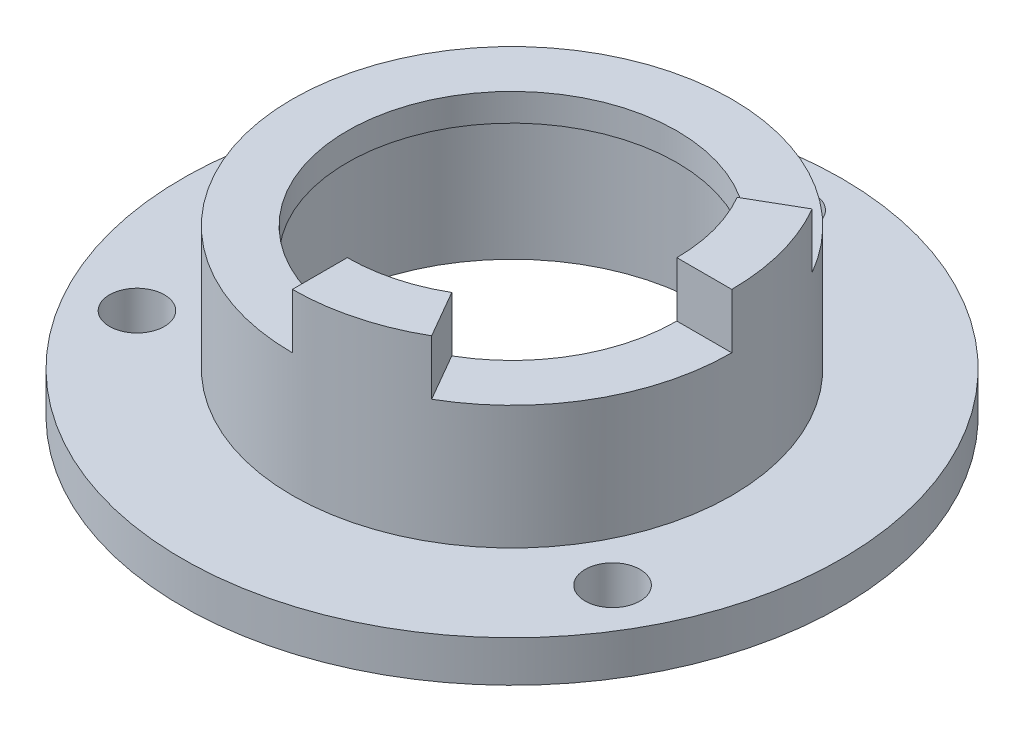
ISO-10303-21;
HEADER;
FILE_DESCRIPTION(('STEP AP214'),'2;1');
FILE_NAME('part.step','',(''),(''),'','','');
FILE_SCHEMA(('AUTOMOTIVE_DESIGN { 1 0 10303 214 1 1 1 1 }'));
ENDSEC;
DATA;
#1=APPLICATION_CONTEXT('core data for automotive mechanical design processes');
#2=APPLICATION_PROTOCOL_DEFINITION('international standard','automotive_design',2000,#1);
#3=PRODUCT_CONTEXT('',#1,'mechanical');
#4=PRODUCT('Part','Part','',(#3));
#5=PRODUCT_RELATED_PRODUCT_CATEGORY('part','',(#4));
#6=PRODUCT_DEFINITION_FORMATION('','',#4);
#7=PRODUCT_DEFINITION_CONTEXT('part definition',#1,'design');
#8=PRODUCT_DEFINITION('design','',#6,#7);
#9=PRODUCT_DEFINITION_SHAPE('','',#8);
#10=(LENGTH_UNIT() NAMED_UNIT(*) SI_UNIT(.MILLI.,.METRE.));
#11=(NAMED_UNIT(*) PLANE_ANGLE_UNIT() SI_UNIT($,.RADIAN.));
#12=(NAMED_UNIT(*) SI_UNIT($,.STERADIAN.) SOLID_ANGLE_UNIT());
#13=UNCERTAINTY_MEASURE_WITH_UNIT(LENGTH_MEASURE(1.E-05),#10,'distance_accuracy_value','');
#14=(GEOMETRIC_REPRESENTATION_CONTEXT(3) GLOBAL_UNCERTAINTY_ASSIGNED_CONTEXT((#13)) GLOBAL_UNIT_ASSIGNED_CONTEXT((#10,
#11,#12)) REPRESENTATION_CONTEXT('',''));
#15=CARTESIAN_POINT('',(0.,0.,0.));
#16=DIRECTION('',(0.,0.,1.));
#17=DIRECTION('',(1.,0.,0.));
#18=AXIS2_PLACEMENT_3D('',#15,#16,#17);
#19=CARTESIAN_POINT('',(0.,16.,12.));
#20=DIRECTION('',(1.,0.,0.));
#21=DIRECTION('',(0.,0.,-1.));
#22=AXIS2_PLACEMENT_3D('',#19,#20,#21);
#23=PLANE('',#22);
#24=DIRECTION('',(0.,-1.,0.));
#25=VECTOR('',#24,1.);
#26=CARTESIAN_POINT('',(0.,10.,16.));
#27=LINE('',#26,#25);
#28=CARTESIAN_POINT('',(0.,16.,16.));
#29=VERTEX_POINT('',#28);
#30=CARTESIAN_POINT('',(0.,12.,16.));
#31=VERTEX_POINT('',#30);
#32=EDGE_CURVE('E155',#29,#31,#27,.T.);
#33=ORIENTED_EDGE('',*,*,#32,.F.);
#34=DIRECTION('',(0.,0.,1.));
#35=VECTOR('',#34,1.);
#36=CARTESIAN_POINT('',(0.,16.,0.));
#37=LINE('',#36,#35);
#38=CARTESIAN_POINT('',(0.,16.,12.));
#39=VERTEX_POINT('',#38);
#40=EDGE_CURVE('E106',#39,#29,#37,.T.);
#41=ORIENTED_EDGE('',*,*,#40,.F.);
#42=DIRECTION('',(0.,-1.,0.));
#43=VECTOR('',#42,1.);
#44=CARTESIAN_POINT('',(0.,12.,12.));
#45=LINE('',#44,#43);
#46=CARTESIAN_POINT('',(0.,12.,12.));
#47=VERTEX_POINT('',#46);
#48=EDGE_CURVE('E159',#39,#47,#45,.T.);
#49=ORIENTED_EDGE('',*,*,#48,.T.);
#50=DIRECTION('',(0.,0.,1.));
#51=VECTOR('',#50,1.);
#52=CARTESIAN_POINT('',(0.,12.,0.));
#53=LINE('',#52,#51);
#54=EDGE_CURVE('E170',#31,#47,#53,.F.);
#55=ORIENTED_EDGE('',*,*,#54,.F.);
#56=EDGE_LOOP('',(#33,#41,#49,#55));
#57=FACE_BOUND('',#56,.T.);
#58=ADVANCED_FACE('F17',(#57),#23,.F.);
#59=CARTESIAN_POINT('',(0.,12.,0.));
#60=DIRECTION('',(0.,1.,0.));
#61=DIRECTION('',(0.,0.,1.));
#62=AXIS2_PLACEMENT_3D('',#59,#60,#61);
#63=PLANE('',#62);
#64=ORIENTED_EDGE('',*,*,#54,.T.);
#65=CARTESIAN_POINT('',(0.,12.,0.));
#66=DIRECTION('',(0.,-1.,0.));
#67=DIRECTION('',(0.,0.,-1.));
#68=AXIS2_PLACEMENT_3D('',#65,#66,#67);
#69=CIRCLE('',#68,12.);
#70=CARTESIAN_POINT('',(10.3923048454133,12.,-5.99999999999991));
#71=VERTEX_POINT('',#70);
#72=EDGE_CURVE('E156',#47,#71,#69,.T.);
#73=ORIENTED_EDGE('',*,*,#72,.T.);
#74=DIRECTION('',(0.866025403784443,0.,-0.499999999999993));
#75=VECTOR('',#74,1.);
#76=CARTESIAN_POINT('',(10.3923048454133,12.,-5.99999999999991));
#77=LINE('',#76,#75);
#78=CARTESIAN_POINT('',(13.8564064605511,12.,-7.99999999999988));
#79=VERTEX_POINT('',#78);
#80=EDGE_CURVE('E172',#71,#79,#77,.T.);
#81=ORIENTED_EDGE('',*,*,#80,.T.);
#82=CARTESIAN_POINT('',(0.,12.,0.));
#83=DIRECTION('',(0.,-1.,0.));
#84=DIRECTION('',(0.,0.,-1.));
#85=AXIS2_PLACEMENT_3D('',#82,#83,#84);
#86=CIRCLE('',#85,16.);
#87=EDGE_CURVE('E153',#31,#79,#86,.T.);
#88=ORIENTED_EDGE('',*,*,#87,.F.);
#89=EDGE_LOOP('',(#64,#73,#81,#88));
#90=FACE_BOUND('',#89,.T.);
#91=ADVANCED_FACE('F195',(#90),#63,.T.);
#92=CARTESIAN_POINT('',(10.3923048454133,16.,-5.99999999999991));
#93=DIRECTION('',(0.499999999999993,0.,0.866025403784443));
#94=DIRECTION('',(0.866025403784443,0.,-0.499999999999993));
#95=AXIS2_PLACEMENT_3D('',#92,#93,#94);
#96=PLANE('',#95);
#97=DIRECTION('',(0.,-1.,0.));
#98=VECTOR('',#97,1.);
#99=CARTESIAN_POINT('',(10.3923048454133,12.,-5.99999999999991));
#100=LINE('',#99,#98);
#101=CARTESIAN_POINT('',(10.3923048454133,16.,-5.99999999999991));
#102=VERTEX_POINT('',#101);
#103=EDGE_CURVE('E105',#71,#102,#100,.F.);
#104=ORIENTED_EDGE('',*,*,#103,.T.);
#105=DIRECTION('',(-0.866025403784443,0.,0.499999999999993));
#106=VECTOR('',#105,1.);
#107=CARTESIAN_POINT('',(13.856406460551,16.,-7.99999999999986));
#108=LINE('',#107,#106);
#109=CARTESIAN_POINT('',(13.8564064605511,16.,-7.99999999999988));
#110=VERTEX_POINT('',#109);
#111=EDGE_CURVE('E90',#110,#102,#108,.T.);
#112=ORIENTED_EDGE('',*,*,#111,.F.);
#113=DIRECTION('',(0.,-1.,0.));
#114=VECTOR('',#113,1.);
#115=CARTESIAN_POINT('',(13.8564064605511,10.,-7.99999999999988));
#116=LINE('',#115,#114);
#117=EDGE_CURVE('E152',#79,#110,#116,.F.);
#118=ORIENTED_EDGE('',*,*,#117,.F.);
#119=ORIENTED_EDGE('',*,*,#80,.F.);
#120=EDGE_LOOP('',(#104,#112,#118,#119));
#121=FACE_BOUND('',#120,.T.);
#122=ADVANCED_FACE('F196',(#121),#96,.F.);
#123=CARTESIAN_POINT('',(0.,16.,0.));
#124=DIRECTION('',(0.,1.,0.));
#125=DIRECTION('',(0.,0.,1.));
#126=AXIS2_PLACEMENT_3D('',#123,#124,#125);
#127=PLANE('',#126);
#128=CARTESIAN_POINT('',(0.,16.,0.));
#129=DIRECTION('',(0.,-1.,0.));
#130=DIRECTION('',(0.,0.,-1.));
#131=AXIS2_PLACEMENT_3D('',#128,#129,#130);
#132=CIRCLE('',#131,16.);
#133=CARTESIAN_POINT('',(16.,16.,1.8115138934941E-12));
#134=VERTEX_POINT('',#133);
#135=EDGE_CURVE('E150',#110,#134,#132,.T.);
#136=ORIENTED_EDGE('',*,*,#135,.F.);
#137=ORIENTED_EDGE('',*,*,#111,.T.);
#138=CARTESIAN_POINT('',(0.,16.,0.));
#139=DIRECTION('',(0.,-1.,0.));
#140=DIRECTION('',(0.,0.,-1.));
#141=AXIS2_PLACEMENT_3D('',#138,#139,#140);
#142=CIRCLE('',#141,12.);
#143=CARTESIAN_POINT('',(12.,16.,1.77144628468258E-12));
#144=VERTEX_POINT('',#143);
#145=EDGE_CURVE('E20',#102,#144,#142,.T.);
#146=ORIENTED_EDGE('',*,*,#145,.T.);
#147=DIRECTION('',(-1.,0.,0.));
#148=VECTOR('',#147,1.);
#149=CARTESIAN_POINT('',(11.9999999999999,16.,1.7717114101429E-12));
#150=LINE('',#149,#148);
#151=EDGE_CURVE('E80',#144,#134,#150,.F.);
#152=ORIENTED_EDGE('',*,*,#151,.T.);
#153=EDGE_LOOP('',(#136,#137,#146,#152));
#154=FACE_BOUND('',#153,.T.);
#155=ADVANCED_FACE('F103',(#154),#127,.T.);
#156=CARTESIAN_POINT('',(11.9999999999999,16.,1.7717114101429E-12));
#157=DIRECTION('',(0.,0.,-1.));
#158=DIRECTION('',(-1.,0.,0.));
#159=AXIS2_PLACEMENT_3D('',#156,#157,#158);
#160=PLANE('',#159);
#161=DIRECTION('',(0.,-1.,0.));
#162=VECTOR('',#161,1.);
#163=CARTESIAN_POINT('',(16.,10.,1.81090425874894E-12));
#164=LINE('',#163,#162);
#165=CARTESIAN_POINT('',(16.,12.,1.8115138934941E-12));
#166=VERTEX_POINT('',#165);
#167=EDGE_CURVE('E85',#134,#166,#164,.T.);
#168=ORIENTED_EDGE('',*,*,#167,.F.);
#169=ORIENTED_EDGE('',*,*,#151,.F.);
#170=DIRECTION('',(0.,-1.,0.));
#171=VECTOR('',#170,1.);
#172=CARTESIAN_POINT('',(12.,12.,1.77118115922226E-12));
#173=LINE('',#172,#171);
#174=CARTESIAN_POINT('',(12.,12.,1.79165234373076E-12));
#175=VERTEX_POINT('',#174);
#176=EDGE_CURVE('E84',#144,#175,#173,.T.);
#177=ORIENTED_EDGE('',*,*,#176,.T.);
#178=DIRECTION('',(1.,0.,0.));
#179=VECTOR('',#178,1.);
#180=CARTESIAN_POINT('',(0.,12.,1.81212352823926E-12));
#181=LINE('',#180,#179);
#182=EDGE_CURVE('E89',#166,#175,#181,.F.);
#183=ORIENTED_EDGE('',*,*,#182,.F.);
#184=EDGE_LOOP('',(#168,#169,#177,#183));
#185=FACE_BOUND('',#184,.T.);
#186=ADVANCED_FACE('F82',(#185),#160,.F.);
#187=CARTESIAN_POINT('',(0.,12.,0.));
#188=DIRECTION('',(0.,1.,0.));
#189=DIRECTION('',(0.,0.,1.));
#190=AXIS2_PLACEMENT_3D('',#187,#188,#189);
#191=PLANE('',#190);
#192=CARTESIAN_POINT('',(0.,12.,0.));
#193=DIRECTION('',(0.,-1.,0.));
#194=DIRECTION('',(0.,0.,-1.));
#195=AXIS2_PLACEMENT_3D('',#192,#193,#194);
#196=CIRCLE('',#195,12.);
#197=CARTESIAN_POINT('',(6.00000000000061,12.,10.3923048454129));
#198=VERTEX_POINT('',#197);
#199=EDGE_CURVE('E101',#175,#198,#196,.T.);
#200=ORIENTED_EDGE('',*,*,#199,.T.);
#201=DIRECTION('',(0.500000000000001,0.,0.866025403784438));
#202=VECTOR('',#201,1.);
#203=CARTESIAN_POINT('',(6.00000000000062,12.,10.3923048454129));
#204=LINE('',#203,#202);
#205=CARTESIAN_POINT('',(8.00000000000061,12.,13.8564064605507));
#206=VERTEX_POINT('',#205);
#207=EDGE_CURVE('E179',#198,#206,#204,.T.);
#208=ORIENTED_EDGE('',*,*,#207,.T.);
#209=CARTESIAN_POINT('',(0.,12.,0.));
#210=DIRECTION('',(0.,-1.,0.));
#211=DIRECTION('',(0.,0.,-1.));
#212=AXIS2_PLACEMENT_3D('',#209,#210,#211);
#213=CIRCLE('',#212,16.);
#214=EDGE_CURVE('E148',#166,#206,#213,.T.);
#215=ORIENTED_EDGE('',*,*,#214,.F.);
#216=ORIENTED_EDGE('',*,*,#182,.T.);
#217=EDGE_LOOP('',(#200,#208,#215,#216));
#218=FACE_BOUND('',#217,.T.);
#219=ADVANCED_FACE('F198',(#218),#191,.T.);
#220=CARTESIAN_POINT('',(6.00000000000062,16.,10.3923048454129));
#221=DIRECTION('',(-0.866025403784438,0.,0.500000000000001));
#222=DIRECTION('',(0.500000000000001,0.,0.866025403784438));
#223=AXIS2_PLACEMENT_3D('',#220,#221,#222);
#224=PLANE('',#223);
#225=DIRECTION('',(0.,-1.,0.));
#226=VECTOR('',#225,1.);
#227=CARTESIAN_POINT('',(6.00000000000061,12.,10.3923048454129));
#228=LINE('',#227,#226);
#229=CARTESIAN_POINT('',(6.00000000000061,16.,10.3923048454129));
#230=VERTEX_POINT('',#229);
#231=EDGE_CURVE('E162',#198,#230,#228,.F.);
#232=ORIENTED_EDGE('',*,*,#231,.T.);
#233=DIRECTION('',(-0.500000000000001,0.,-0.866025403784438));
#234=VECTOR('',#233,1.);
#235=CARTESIAN_POINT('',(8.00000000000062,16.,13.8564064605507));
#236=LINE('',#235,#234);
#237=CARTESIAN_POINT('',(8.00000000000061,16.,13.8564064605507));
#238=VERTEX_POINT('',#237);
#239=EDGE_CURVE('E110',#238,#230,#236,.T.);
#240=ORIENTED_EDGE('',*,*,#239,.F.);
#241=DIRECTION('',(0.,-1.,0.));
#242=VECTOR('',#241,1.);
#243=CARTESIAN_POINT('',(8.00000000000061,10.,13.8564064605507));
#244=LINE('',#243,#242);
#245=EDGE_CURVE('E35',#206,#238,#244,.F.);
#246=ORIENTED_EDGE('',*,*,#245,.F.);
#247=ORIENTED_EDGE('',*,*,#207,.F.);
#248=EDGE_LOOP('',(#232,#240,#246,#247));
#249=FACE_BOUND('',#248,.T.);
#250=ADVANCED_FACE('F199',(#249),#224,.F.);
#251=CARTESIAN_POINT('',(0.,16.,0.));
#252=DIRECTION('',(0.,1.,0.));
#253=DIRECTION('',(0.,0.,1.));
#254=AXIS2_PLACEMENT_3D('',#251,#252,#253);
#255=PLANE('',#254);
#256=CARTESIAN_POINT('',(0.,16.,0.));
#257=DIRECTION('',(0.,-1.,0.));
#258=DIRECTION('',(0.,0.,-1.));
#259=AXIS2_PLACEMENT_3D('',#256,#257,#258);
#260=CIRCLE('',#259,12.);
#261=EDGE_CURVE('E160',#230,#39,#260,.T.);
#262=ORIENTED_EDGE('',*,*,#261,.T.);
#263=ORIENTED_EDGE('',*,*,#40,.T.);
#264=CARTESIAN_POINT('',(0.,16.,0.));
#265=DIRECTION('',(0.,-1.,0.));
#266=DIRECTION('',(0.,0.,-1.));
#267=AXIS2_PLACEMENT_3D('',#264,#265,#266);
#268=CIRCLE('',#267,16.);
#269=EDGE_CURVE('E146',#238,#29,#268,.T.);
#270=ORIENTED_EDGE('',*,*,#269,.F.);
#271=ORIENTED_EDGE('',*,*,#239,.T.);
#272=EDGE_LOOP('',(#262,#263,#270,#271));
#273=FACE_BOUND('',#272,.T.);
#274=ADVANCED_FACE('F187',(#273),#255,.T.);
#275=CARTESIAN_POINT('',(0.,12.,0.));
#276=DIRECTION('',(0.,-1.,0.));
#277=DIRECTION('',(0.,0.,-1.));
#278=AXIS2_PLACEMENT_3D('',#275,#276,#277);
#279=CYLINDRICAL_SURFACE('',#278,12.);
#280=CARTESIAN_POINT('',(0.,10.,0.));
#281=DIRECTION('',(0.,-1.,0.));
#282=DIRECTION('',(0.,0.,-1.));
#283=AXIS2_PLACEMENT_3D('',#280,#281,#282);
#284=CIRCLE('',#283,12.);
#285=CARTESIAN_POINT('',(0.,10.,-12.));
#286=VERTEX_POINT('',#285);
#287=EDGE_CURVE('E143',#286,#286,#284,.T.);
#288=ORIENTED_EDGE('',*,*,#287,.T.);
#289=EDGE_LOOP('',(#288));
#290=FACE_BOUND('',#289,.T.);
#291=ORIENTED_EDGE('',*,*,#72,.F.);
#292=ORIENTED_EDGE('',*,*,#48,.F.);
#293=ORIENTED_EDGE('',*,*,#261,.F.);
#294=ORIENTED_EDGE('',*,*,#231,.F.);
#295=ORIENTED_EDGE('',*,*,#199,.F.);
#296=ORIENTED_EDGE('',*,*,#176,.F.);
#297=ORIENTED_EDGE('',*,*,#145,.F.);
#298=ORIENTED_EDGE('',*,*,#103,.F.);
#299=EDGE_LOOP('',(#291,#292,#293,#294,#295,#296,#297,#298));
#300=FACE_BOUND('',#299,.T.);
#301=ADVANCED_FACE('F96',(#290,#300),#279,.F.);
#302=CARTESIAN_POINT('',(0.,10.,0.));
#303=DIRECTION('',(0.,-1.,0.));
#304=DIRECTION('',(0.,0.,-1.));
#305=AXIS2_PLACEMENT_3D('',#302,#303,#304);
#306=CYLINDRICAL_SURFACE('',#305,16.);
#307=CARTESIAN_POINT('',(0.,3.,0.));
#308=DIRECTION('',(0.,-1.,0.));
#309=DIRECTION('',(0.,0.,-1.));
#310=AXIS2_PLACEMENT_3D('',#307,#308,#309);
#311=CIRCLE('',#310,16.);
#312=CARTESIAN_POINT('',(0.,3.,-16.));
#313=VERTEX_POINT('',#312);
#314=EDGE_CURVE('E140',#313,#313,#311,.F.);
#315=ORIENTED_EDGE('',*,*,#314,.T.);
#316=EDGE_LOOP('',(#315));
#317=FACE_BOUND('',#316,.T.);
#318=ORIENTED_EDGE('',*,*,#245,.T.);
#319=ORIENTED_EDGE('',*,*,#269,.T.);
#320=ORIENTED_EDGE('',*,*,#32,.T.);
#321=ORIENTED_EDGE('',*,*,#87,.T.);
#322=ORIENTED_EDGE('',*,*,#117,.T.);
#323=ORIENTED_EDGE('',*,*,#135,.T.);
#324=ORIENTED_EDGE('',*,*,#167,.T.);
#325=ORIENTED_EDGE('',*,*,#214,.T.);
#326=EDGE_LOOP('',(#318,#319,#320,#321,#322,#323,#324,#325));
#327=FACE_BOUND('',#326,.T.);
#328=ADVANCED_FACE('F192',(#317,#327),#306,.T.);
#329=CARTESIAN_POINT('',(0.,10.,0.));
#330=DIRECTION('',(0.,1.,0.));
#331=DIRECTION('',(0.,0.,1.));
#332=AXIS2_PLACEMENT_3D('',#329,#330,#331);
#333=PLANE('',#332);
#334=ORIENTED_EDGE('',*,*,#287,.F.);
#335=EDGE_LOOP('',(#334));
#336=FACE_BOUND('',#335,.T.);
#337=CARTESIAN_POINT('',(0.,10.,0.));
#338=DIRECTION('',(0.,-1.,0.));
#339=DIRECTION('',(0.,0.,-1.));
#340=AXIS2_PLACEMENT_3D('',#337,#338,#339);
#341=CIRCLE('',#340,14.);
#342=CARTESIAN_POINT('',(0.,10.,-14.));
#343=VERTEX_POINT('',#342);
#344=EDGE_CURVE('E137',#343,#343,#341,.T.);
#345=ORIENTED_EDGE('',*,*,#344,.T.);
#346=EDGE_LOOP('',(#345));
#347=FACE_BOUND('',#346,.T.);
#348=ADVANCED_FACE('F241',(#336,#347),#333,.F.);
#349=CARTESIAN_POINT('',(0.,3.,0.));
#350=DIRECTION('',(0.,-1.,0.));
#351=DIRECTION('',(0.,0.,-1.));
#352=AXIS2_PLACEMENT_3D('',#349,#350,#351);
#353=PLANE('',#352);
#354=ORIENTED_EDGE('',*,*,#314,.F.);
#355=EDGE_LOOP('',(#354));
#356=FACE_BOUND('',#355,.T.);
#357=CARTESIAN_POINT('',(17.3178924814772,3.,9.99848988597762));
#358=DIRECTION('',(0.,-1.,0.));
#359=DIRECTION('',(0.,0.,-1.));
#360=AXIS2_PLACEMENT_3D('',#357,#358,#359);
#361=CIRCLE('',#360,2.);
#362=CARTESIAN_POINT('',(17.3178924814772,3.,7.99848988597762));
#363=VERTEX_POINT('',#362);
#364=EDGE_CURVE('E125',#363,#363,#361,.T.);
#365=ORIENTED_EDGE('',*,*,#364,.T.);
#366=EDGE_LOOP('',(#365));
#367=FACE_BOUND('',#366,.T.);
#368=CARTESIAN_POINT('',(-17.317892481477,3.,9.99848988597786));
#369=DIRECTION('',(0.,-1.,0.));
#370=DIRECTION('',(0.,0.,-1.));
#371=AXIS2_PLACEMENT_3D('',#368,#369,#370);
#372=CIRCLE('',#371,2.);
#373=CARTESIAN_POINT('',(-17.317892481477,3.,7.99848988597786));
#374=VERTEX_POINT('',#373);
#375=EDGE_CURVE('E128',#374,#374,#372,.T.);
#376=ORIENTED_EDGE('',*,*,#375,.T.);
#377=EDGE_LOOP('',(#376));
#378=FACE_BOUND('',#377,.T.);
#379=CARTESIAN_POINT('',(0.,3.,-19.9969797719556));
#380=DIRECTION('',(0.,-1.,0.));
#381=DIRECTION('',(0.,0.,-1.));
#382=AXIS2_PLACEMENT_3D('',#379,#380,#381);
#383=CIRCLE('',#382,2.);
#384=CARTESIAN_POINT('',(0.,3.,-21.9969797719556));
#385=VERTEX_POINT('',#384);
#386=EDGE_CURVE('E131',#385,#385,#383,.T.);
#387=ORIENTED_EDGE('',*,*,#386,.T.);
#388=EDGE_LOOP('',(#387));
#389=FACE_BOUND('',#388,.T.);
#390=CARTESIAN_POINT('',(0.,3.,0.));
#391=DIRECTION('',(0.,-1.,0.));
#392=DIRECTION('',(0.,0.,-1.));
#393=AXIS2_PLACEMENT_3D('',#390,#391,#392);
#394=CIRCLE('',#393,24.);
#395=CARTESIAN_POINT('',(0.,3.,-24.));
#396=VERTEX_POINT('',#395);
#397=EDGE_CURVE('E134',#396,#396,#394,.T.);
#398=ORIENTED_EDGE('',*,*,#397,.F.);
#399=EDGE_LOOP('',(#398));
#400=FACE_BOUND('',#399,.T.);
#401=ADVANCED_FACE('F237',(#356,#367,#378,#389,#400),#353,.F.);
#402=CARTESIAN_POINT('',(0.,10.,0.));
#403=DIRECTION('',(0.,-1.,0.));
#404=DIRECTION('',(0.,0.,-1.));
#405=AXIS2_PLACEMENT_3D('',#402,#403,#404);
#406=CYLINDRICAL_SURFACE('',#405,14.);
#407=CARTESIAN_POINT('',(0.,0.,0.));
#408=DIRECTION('',(0.,-1.,0.));
#409=DIRECTION('',(0.,0.,-1.));
#410=AXIS2_PLACEMENT_3D('',#407,#408,#409);
#411=CIRCLE('',#410,14.);
#412=CARTESIAN_POINT('',(0.,0.,-14.));
#413=VERTEX_POINT('',#412);
#414=EDGE_CURVE('E122',#413,#413,#411,.T.);
#415=ORIENTED_EDGE('',*,*,#414,.T.);
#416=EDGE_LOOP('',(#415));
#417=FACE_BOUND('',#416,.T.);
#418=ORIENTED_EDGE('',*,*,#344,.F.);
#419=EDGE_LOOP('',(#418));
#420=FACE_BOUND('',#419,.T.);
#421=ADVANCED_FACE('F233',(#417,#420),#406,.F.);
#422=CARTESIAN_POINT('',(0.,3.,0.));
#423=DIRECTION('',(0.,-1.,0.));
#424=DIRECTION('',(0.,0.,-1.));
#425=AXIS2_PLACEMENT_3D('',#422,#423,#424);
#426=CYLINDRICAL_SURFACE('',#425,24.);
#427=CARTESIAN_POINT('',(0.,0.,0.));
#428=DIRECTION('',(0.,-1.,0.));
#429=DIRECTION('',(0.,0.,-1.));
#430=AXIS2_PLACEMENT_3D('',#427,#428,#429);
#431=CIRCLE('',#430,24.);
#432=CARTESIAN_POINT('',(0.,0.,-24.));
#433=VERTEX_POINT('',#432);
#434=EDGE_CURVE('E119',#433,#433,#431,.F.);
#435=ORIENTED_EDGE('',*,*,#434,.T.);
#436=EDGE_LOOP('',(#435));
#437=FACE_BOUND('',#436,.T.);
#438=ORIENTED_EDGE('',*,*,#397,.T.);
#439=EDGE_LOOP('',(#438));
#440=FACE_BOUND('',#439,.T.);
#441=ADVANCED_FACE('F229',(#437,#440),#426,.T.);
#442=CARTESIAN_POINT('',(0.,3.,-19.9969797719556));
#443=DIRECTION('',(0.,-1.,0.));
#444=DIRECTION('',(0.,0.,-1.));
#445=AXIS2_PLACEMENT_3D('',#442,#443,#444);
#446=CYLINDRICAL_SURFACE('',#445,2.);
#447=ORIENTED_EDGE('',*,*,#386,.F.);
#448=EDGE_LOOP('',(#447));
#449=FACE_BOUND('',#448,.T.);
#450=CARTESIAN_POINT('',(0.,0.,-19.9969797719556));
#451=DIRECTION('',(0.,-1.,0.));
#452=DIRECTION('',(0.,0.,-1.));
#453=AXIS2_PLACEMENT_3D('',#450,#451,#452);
#454=CIRCLE('',#453,2.);
#455=CARTESIAN_POINT('',(0.,0.,-21.9969797719556));
#456=VERTEX_POINT('',#455);
#457=EDGE_CURVE('E116',#456,#456,#454,.T.);
#458=ORIENTED_EDGE('',*,*,#457,.T.);
#459=EDGE_LOOP('',(#458));
#460=FACE_BOUND('',#459,.T.);
#461=ADVANCED_FACE('F225',(#449,#460),#446,.F.);
#462=CARTESIAN_POINT('',(-17.317892481477,3.,9.99848988597786));
#463=DIRECTION('',(0.,-1.,0.));
#464=DIRECTION('',(0.,0.,-1.));
#465=AXIS2_PLACEMENT_3D('',#462,#463,#464);
#466=CYLINDRICAL_SURFACE('',#465,2.);
#467=ORIENTED_EDGE('',*,*,#375,.F.);
#468=EDGE_LOOP('',(#467));
#469=FACE_BOUND('',#468,.T.);
#470=CARTESIAN_POINT('',(-17.317892481477,0.,9.99848988597786));
#471=DIRECTION('',(0.,-1.,0.));
#472=DIRECTION('',(0.,0.,-1.));
#473=AXIS2_PLACEMENT_3D('',#470,#471,#472);
#474=CIRCLE('',#473,2.);
#475=CARTESIAN_POINT('',(-17.317892481477,0.,7.99848988597786));
#476=VERTEX_POINT('',#475);
#477=EDGE_CURVE('E26',#476,#476,#474,.T.);
#478=ORIENTED_EDGE('',*,*,#477,.T.);
#479=EDGE_LOOP('',(#478));
#480=FACE_BOUND('',#479,.T.);
#481=ADVANCED_FACE('F217',(#469,#480),#466,.F.);
#482=CARTESIAN_POINT('',(17.3178924814772,3.,9.99848988597762));
#483=DIRECTION('',(0.,-1.,0.));
#484=DIRECTION('',(0.,0.,-1.));
#485=AXIS2_PLACEMENT_3D('',#482,#483,#484);
#486=CYLINDRICAL_SURFACE('',#485,2.);
#487=ORIENTED_EDGE('',*,*,#364,.F.);
#488=EDGE_LOOP('',(#487));
#489=FACE_BOUND('',#488,.T.);
#490=CARTESIAN_POINT('',(17.3178924814772,0.,9.99848988597762));
#491=DIRECTION('',(0.,-1.,0.));
#492=DIRECTION('',(0.,0.,-1.));
#493=AXIS2_PLACEMENT_3D('',#490,#491,#492);
#494=CIRCLE('',#493,2.);
#495=CARTESIAN_POINT('',(17.3178924814772,0.,7.99848988597762));
#496=VERTEX_POINT('',#495);
#497=EDGE_CURVE('E11',#496,#496,#494,.T.);
#498=ORIENTED_EDGE('',*,*,#497,.T.);
#499=EDGE_LOOP('',(#498));
#500=FACE_BOUND('',#499,.T.);
#501=ADVANCED_FACE('F211',(#489,#500),#486,.F.);
#502=CARTESIAN_POINT('',(0.,0.,0.));
#503=DIRECTION('',(0.,1.,0.));
#504=DIRECTION('',(0.,0.,1.));
#505=AXIS2_PLACEMENT_3D('',#502,#503,#504);
#506=PLANE('',#505);
#507=ORIENTED_EDGE('',*,*,#497,.F.);
#508=EDGE_LOOP('',(#507));
#509=FACE_BOUND('',#508,.T.);
#510=ORIENTED_EDGE('',*,*,#477,.F.);
#511=EDGE_LOOP('',(#510));
#512=FACE_BOUND('',#511,.T.);
#513=ORIENTED_EDGE('',*,*,#457,.F.);
#514=EDGE_LOOP('',(#513));
#515=FACE_BOUND('',#514,.T.);
#516=ORIENTED_EDGE('',*,*,#434,.F.);
#517=EDGE_LOOP('',(#516));
#518=FACE_BOUND('',#517,.T.);
#519=ORIENTED_EDGE('',*,*,#414,.F.);
#520=EDGE_LOOP('',(#519));
#521=FACE_BOUND('',#520,.T.);
#522=ADVANCED_FACE('F209',(#509,#512,#515,#518,#521),#506,.F.);
#523=CLOSED_SHELL('',(#58,#91,#122,#155,#186,#219,#250,#274,#301,#328,#348,#401,#421,#441,#461,
#481,#501,#522));
#524=MANIFOLD_SOLID_BREP('B1',#523);
#525=ADVANCED_BREP_SHAPE_REPRESENTATION('',(#18,#524),#14);
#526=SHAPE_DEFINITION_REPRESENTATION(#9,#525);
ENDSEC;
END-ISO-10303-21;
